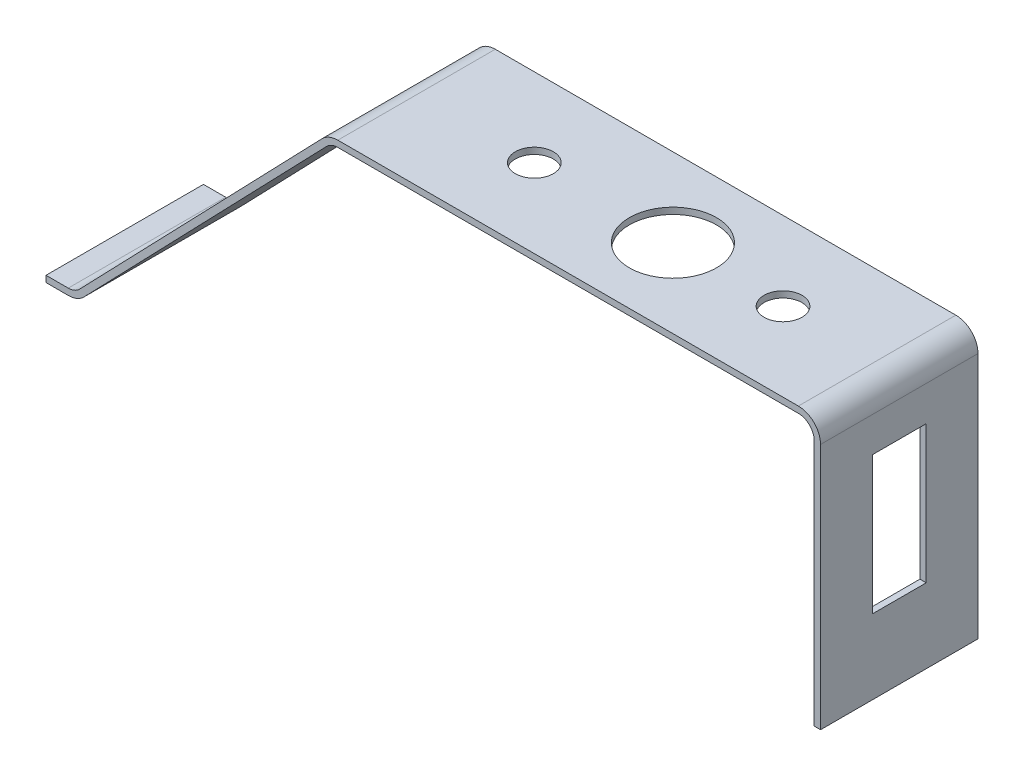
ISO-10303-21;
HEADER;
FILE_DESCRIPTION(('STEP AP214'),'2;1');
FILE_NAME('part.step','',(''),(''),'','','');
FILE_SCHEMA(('AUTOMOTIVE_DESIGN { 1 0 10303 214 1 1 1 1 }'));
ENDSEC;
DATA;
#1=APPLICATION_CONTEXT('core data for automotive mechanical design processes');
#2=APPLICATION_PROTOCOL_DEFINITION('international standard','automotive_design',2000,#1);
#3=PRODUCT_CONTEXT('',#1,'mechanical');
#4=PRODUCT('Part','Part','',(#3));
#5=PRODUCT_RELATED_PRODUCT_CATEGORY('part','',(#4));
#6=PRODUCT_DEFINITION_FORMATION('','',#4);
#7=PRODUCT_DEFINITION_CONTEXT('part definition',#1,'design');
#8=PRODUCT_DEFINITION('design','',#6,#7);
#9=PRODUCT_DEFINITION_SHAPE('','',#8);
#10=(LENGTH_UNIT() NAMED_UNIT(*) SI_UNIT(.MILLI.,.METRE.));
#11=(NAMED_UNIT(*) PLANE_ANGLE_UNIT() SI_UNIT($,.RADIAN.));
#12=(NAMED_UNIT(*) SI_UNIT($,.STERADIAN.) SOLID_ANGLE_UNIT());
#13=UNCERTAINTY_MEASURE_WITH_UNIT(LENGTH_MEASURE(1.E-05),#10,'distance_accuracy_value','');
#14=(GEOMETRIC_REPRESENTATION_CONTEXT(3) GLOBAL_UNCERTAINTY_ASSIGNED_CONTEXT((#13)) GLOBAL_UNIT_ASSIGNED_CONTEXT((#10,
#11,#12)) REPRESENTATION_CONTEXT('',''));
#15=CARTESIAN_POINT('',(0.,0.,0.));
#16=DIRECTION('',(0.,0.,1.));
#17=DIRECTION('',(1.,0.,0.));
#18=AXIS2_PLACEMENT_3D('',#15,#16,#17);
#19=CARTESIAN_POINT('',(61.595,19.812,6.3119));
#20=DIRECTION('',(1.,0.,0.));
#21=DIRECTION('',(0.,0.,-1.));
#22=AXIS2_PLACEMENT_3D('',#19,#20,#21);
#23=PLANE('',#22);
#24=DIRECTION('',(0.,0.,1.));
#25=VECTOR('',#24,1.);
#26=CARTESIAN_POINT('',(61.595,5.969,2.159));
#27=LINE('',#26,#25);
#28=CARTESIAN_POINT('',(61.595,5.969,-2.159));
#29=VERTEX_POINT('',#28);
#30=CARTESIAN_POINT('',(61.595,5.969,2.159));
#31=VERTEX_POINT('',#30);
#32=EDGE_CURVE('E183',#29,#31,#27,.T.);
#33=ORIENTED_EDGE('',*,*,#32,.F.);
#34=DIRECTION('',(0.,-1.,0.));
#35=VECTOR('',#34,1.);
#36=CARTESIAN_POINT('',(61.595,17.018,-2.159));
#37=LINE('',#36,#35);
#38=CARTESIAN_POINT('',(61.595,17.018,-2.159));
#39=VERTEX_POINT('',#38);
#40=EDGE_CURVE('E191',#39,#29,#37,.T.);
#41=ORIENTED_EDGE('',*,*,#40,.F.);
#42=DIRECTION('',(0.,0.,-1.));
#43=VECTOR('',#42,1.);
#44=CARTESIAN_POINT('',(61.595,17.018,2.159));
#45=LINE('',#44,#43);
#46=CARTESIAN_POINT('',(61.595,17.018,2.159));
#47=VERTEX_POINT('',#46);
#48=EDGE_CURVE('E197',#47,#39,#45,.T.);
#49=ORIENTED_EDGE('',*,*,#48,.F.);
#50=DIRECTION('',(0.,1.,0.));
#51=VECTOR('',#50,1.);
#52=CARTESIAN_POINT('',(61.595,17.018,2.159));
#53=LINE('',#52,#51);
#54=EDGE_CURVE('E58',#31,#47,#53,.T.);
#55=ORIENTED_EDGE('',*,*,#54,.F.);
#56=EDGE_LOOP('',(#33,#41,#49,#55));
#57=FACE_BOUND('',#56,.T.);
#58=DIRECTION('',(0.,-1.,0.));
#59=VECTOR('',#58,1.);
#60=CARTESIAN_POINT('',(61.595,19.812,-6.3119));
#61=LINE('',#60,#59);
#62=CARTESIAN_POINT('',(61.595,19.812,-6.3119));
#63=VERTEX_POINT('',#62);
#64=CARTESIAN_POINT('',(61.595,0.,-6.3119));
#65=VERTEX_POINT('',#64);
#66=EDGE_CURVE('E205',#63,#65,#61,.T.);
#67=ORIENTED_EDGE('',*,*,#66,.T.);
#68=DIRECTION('',(0.,0.,-1.));
#69=VECTOR('',#68,1.);
#70=CARTESIAN_POINT('',(61.595,0.,6.3119));
#71=LINE('',#70,#69);
#72=CARTESIAN_POINT('',(61.595,0.,6.3119));
#73=VERTEX_POINT('',#72);
#74=EDGE_CURVE('E11',#73,#65,#71,.T.);
#75=ORIENTED_EDGE('',*,*,#74,.F.);
#76=DIRECTION('',(0.,-1.,0.));
#77=VECTOR('',#76,1.);
#78=CARTESIAN_POINT('',(61.595,19.812,6.3119));
#79=LINE('',#78,#77);
#80=CARTESIAN_POINT('',(61.595,19.812,6.3119));
#81=VERTEX_POINT('',#80);
#82=EDGE_CURVE('E217',#81,#73,#79,.T.);
#83=ORIENTED_EDGE('',*,*,#82,.F.);
#84=DIRECTION('',(0.,0.,-1.));
#85=VECTOR('',#84,1.);
#86=CARTESIAN_POINT('',(61.595,19.812,6.3119));
#87=LINE('',#86,#85);
#88=EDGE_CURVE('E275',#81,#63,#87,.T.);
#89=ORIENTED_EDGE('',*,*,#88,.T.);
#90=EDGE_LOOP('',(#67,#75,#83,#89));
#91=FACE_BOUND('',#90,.T.);
#92=ADVANCED_FACE('F43',(#57,#91),#23,.F.);
#93=CARTESIAN_POINT('',(62.103,0.,6.3119));
#94=DIRECTION('',(0.,-1.,0.));
#95=DIRECTION('',(0.,0.,-1.));
#96=AXIS2_PLACEMENT_3D('',#93,#94,#95);
#97=PLANE('',#96);
#98=DIRECTION('',(-1.,0.,0.));
#99=VECTOR('',#98,1.);
#100=CARTESIAN_POINT('',(62.103,0.,-6.3119));
#101=LINE('',#100,#99);
#102=CARTESIAN_POINT('',(62.103,0.,-6.3119));
#103=VERTEX_POINT('',#102);
#104=EDGE_CURVE('E279',#103,#65,#101,.T.);
#105=ORIENTED_EDGE('',*,*,#104,.F.);
#106=DIRECTION('',(0.,0.,-1.));
#107=VECTOR('',#106,1.);
#108=CARTESIAN_POINT('',(62.103,0.,6.3119));
#109=LINE('',#108,#107);
#110=CARTESIAN_POINT('',(62.103,0.,6.3119));
#111=VERTEX_POINT('',#110);
#112=EDGE_CURVE('E51',#111,#103,#109,.T.);
#113=ORIENTED_EDGE('',*,*,#112,.F.);
#114=DIRECTION('',(-1.,0.,0.));
#115=VECTOR('',#114,1.);
#116=CARTESIAN_POINT('',(62.103,0.,6.3119));
#117=LINE('',#116,#115);
#118=EDGE_CURVE('E220',#111,#73,#117,.T.);
#119=ORIENTED_EDGE('',*,*,#118,.T.);
#120=ORIENTED_EDGE('',*,*,#74,.T.);
#121=EDGE_LOOP('',(#105,#113,#119,#120));
#122=FACE_BOUND('',#121,.T.);
#123=ADVANCED_FACE('F388',(#122),#97,.T.);
#124=CARTESIAN_POINT('',(62.103,19.812,6.3119));
#125=DIRECTION('',(1.,0.,0.));
#126=DIRECTION('',(0.,0.,-1.));
#127=AXIS2_PLACEMENT_3D('',#124,#125,#126);
#128=PLANE('',#127);
#129=DIRECTION('',(0.,1.,0.));
#130=VECTOR('',#129,1.);
#131=CARTESIAN_POINT('',(62.103,17.018,-2.159));
#132=LINE('',#131,#130);
#133=CARTESIAN_POINT('',(62.103,5.969,-2.159));
#134=VERTEX_POINT('',#133);
#135=CARTESIAN_POINT('',(62.103,17.018,-2.159));
#136=VERTEX_POINT('',#135);
#137=EDGE_CURVE('E66',#134,#136,#132,.T.);
#138=ORIENTED_EDGE('',*,*,#137,.F.);
#139=DIRECTION('',(0.,0.,-1.));
#140=VECTOR('',#139,1.);
#141=CARTESIAN_POINT('',(62.103,5.969,2.159));
#142=LINE('',#141,#140);
#143=CARTESIAN_POINT('',(62.103,5.969,2.159));
#144=VERTEX_POINT('',#143);
#145=EDGE_CURVE('E185',#144,#134,#142,.T.);
#146=ORIENTED_EDGE('',*,*,#145,.F.);
#147=DIRECTION('',(0.,-1.,0.));
#148=VECTOR('',#147,1.);
#149=CARTESIAN_POINT('',(62.103,17.018,2.159));
#150=LINE('',#149,#148);
#151=CARTESIAN_POINT('',(62.103,17.018,2.159));
#152=VERTEX_POINT('',#151);
#153=EDGE_CURVE('E484',#152,#144,#150,.T.);
#154=ORIENTED_EDGE('',*,*,#153,.F.);
#155=DIRECTION('',(0.,0.,1.));
#156=VECTOR('',#155,1.);
#157=CARTESIAN_POINT('',(62.103,17.018,2.159));
#158=LINE('',#157,#156);
#159=EDGE_CURVE('E479',#136,#152,#158,.T.);
#160=ORIENTED_EDGE('',*,*,#159,.F.);
#161=EDGE_LOOP('',(#138,#146,#154,#160));
#162=FACE_BOUND('',#161,.T.);
#163=DIRECTION('',(0.,1.,0.));
#164=VECTOR('',#163,1.);
#165=CARTESIAN_POINT('',(62.103,19.812,-6.3119));
#166=LINE('',#165,#164);
#167=CARTESIAN_POINT('',(62.103,19.812,-6.3119));
#168=VERTEX_POINT('',#167);
#169=EDGE_CURVE('E283',#168,#103,#166,.F.);
#170=ORIENTED_EDGE('',*,*,#169,.F.);
#171=DIRECTION('',(0.,0.,-1.));
#172=VECTOR('',#171,1.);
#173=CARTESIAN_POINT('',(62.103,19.812,6.3119));
#174=LINE('',#173,#172);
#175=CARTESIAN_POINT('',(62.103,19.812,6.3119));
#176=VERTEX_POINT('',#175);
#177=EDGE_CURVE('E376',#176,#168,#174,.T.);
#178=ORIENTED_EDGE('',*,*,#177,.F.);
#179=DIRECTION('',(0.,1.,0.));
#180=VECTOR('',#179,1.);
#181=CARTESIAN_POINT('',(62.103,19.812,6.3119));
#182=LINE('',#181,#180);
#183=EDGE_CURVE('E225',#176,#111,#182,.F.);
#184=ORIENTED_EDGE('',*,*,#183,.T.);
#185=ORIENTED_EDGE('',*,*,#112,.T.);
#186=EDGE_LOOP('',(#170,#178,#184,#185));
#187=FACE_BOUND('',#186,.T.);
#188=ADVANCED_FACE('F384',(#162,#187),#128,.T.);
#189=CARTESIAN_POINT('',(60.325,19.812,6.3119));
#190=DIRECTION('',(0.,0.,-1.));
#191=DIRECTION('',(-1.,0.,0.));
#192=AXIS2_PLACEMENT_3D('',#189,#190,#191);
#193=CYLINDRICAL_SURFACE('',#192,1.778);
#194=CARTESIAN_POINT('',(60.325,19.812,-6.3119));
#195=DIRECTION('',(0.,0.,1.));
#196=DIRECTION('',(1.,0.,0.));
#197=AXIS2_PLACEMENT_3D('',#194,#195,#196);
#198=CIRCLE('',#197,1.778);
#199=CARTESIAN_POINT('',(60.325,21.59,-6.3119));
#200=VERTEX_POINT('',#199);
#201=EDGE_CURVE('E287',#200,#168,#198,.F.);
#202=ORIENTED_EDGE('',*,*,#201,.F.);
#203=DIRECTION('',(0.,0.,-1.));
#204=VECTOR('',#203,1.);
#205=CARTESIAN_POINT('',(60.325,21.59,6.3119));
#206=LINE('',#205,#204);
#207=CARTESIAN_POINT('',(60.325,21.59,6.3119));
#208=VERTEX_POINT('',#207);
#209=EDGE_CURVE('E373',#208,#200,#206,.T.);
#210=ORIENTED_EDGE('',*,*,#209,.F.);
#211=CARTESIAN_POINT('',(60.325,19.812,6.3119));
#212=DIRECTION('',(0.,0.,1.));
#213=DIRECTION('',(1.,0.,0.));
#214=AXIS2_PLACEMENT_3D('',#211,#212,#213);
#215=CIRCLE('',#214,1.778);
#216=EDGE_CURVE('E229',#208,#176,#215,.F.);
#217=ORIENTED_EDGE('',*,*,#216,.T.);
#218=ORIENTED_EDGE('',*,*,#177,.T.);
#219=EDGE_LOOP('',(#202,#210,#217,#218));
#220=FACE_BOUND('',#219,.T.);
#221=ADVANCED_FACE('F396',(#220),#193,.T.);
#222=CARTESIAN_POINT('',(23.3997947565347,21.59,6.3119));
#223=DIRECTION('',(0.,1.,0.));
#224=DIRECTION('',(-1.,0.,0.));
#225=AXIS2_PLACEMENT_3D('',#222,#223,#224);
#226=PLANE('',#225);
#227=CARTESIAN_POINT('',(52.7812,21.59,0.));
#228=DIRECTION('',(0.,1.,0.));
#229=DIRECTION('',(-1.,0.,0.));
#230=AXIS2_PLACEMENT_3D('',#227,#228,#229);
#231=CIRCLE('',#230,1.524);
#232=CARTESIAN_POINT('',(51.2572,21.59,0.));
#233=VERTEX_POINT('',#232);
#234=EDGE_CURVE('E507',#233,#233,#231,.T.);
#235=ORIENTED_EDGE('',*,*,#234,.F.);
#236=EDGE_LOOP('',(#235));
#237=FACE_BOUND('',#236,.T.);
#238=CARTESIAN_POINT('',(43.9547,21.59,0.));
#239=DIRECTION('',(0.,1.,0.));
#240=DIRECTION('',(-1.,0.,0.));
#241=AXIS2_PLACEMENT_3D('',#238,#239,#240);
#242=CIRCLE('',#241,3.49250000000001);
#243=CARTESIAN_POINT('',(40.4622,21.59,0.));
#244=VERTEX_POINT('',#243);
#245=EDGE_CURVE('E498',#244,#244,#242,.T.);
#246=ORIENTED_EDGE('',*,*,#245,.F.);
#247=EDGE_LOOP('',(#246));
#248=FACE_BOUND('',#247,.T.);
#249=CARTESIAN_POINT('',(32.8422,21.59,0.));
#250=DIRECTION('',(0.,1.,0.));
#251=DIRECTION('',(-1.,0.,0.));
#252=AXIS2_PLACEMENT_3D('',#249,#250,#251);
#253=CIRCLE('',#252,1.524);
#254=CARTESIAN_POINT('',(31.3182,21.59,0.));
#255=VERTEX_POINT('',#254);
#256=EDGE_CURVE('E499',#255,#255,#253,.T.);
#257=ORIENTED_EDGE('',*,*,#256,.F.);
#258=EDGE_LOOP('',(#257));
#259=FACE_BOUND('',#258,.T.);
#260=DIRECTION('',(1.,0.,0.));
#261=VECTOR('',#260,1.);
#262=CARTESIAN_POINT('',(23.3997947565347,21.59,-6.3119));
#263=LINE('',#262,#261);
#264=CARTESIAN_POINT('',(23.3997947565347,21.59,-6.3119));
#265=VERTEX_POINT('',#264);
#266=EDGE_CURVE('E291',#265,#200,#263,.T.);
#267=ORIENTED_EDGE('',*,*,#266,.F.);
#268=DIRECTION('',(0.,0.,-1.));
#269=VECTOR('',#268,1.);
#270=CARTESIAN_POINT('',(23.3997947565347,21.59,6.3119));
#271=LINE('',#270,#269);
#272=CARTESIAN_POINT('',(23.3997947565347,21.59,6.3119));
#273=VERTEX_POINT('',#272);
#274=EDGE_CURVE('E370',#273,#265,#271,.T.);
#275=ORIENTED_EDGE('',*,*,#274,.F.);
#276=DIRECTION('',(1.,0.,0.));
#277=VECTOR('',#276,1.);
#278=CARTESIAN_POINT('',(23.3997947565347,21.59,6.3119));
#279=LINE('',#278,#277);
#280=EDGE_CURVE('E233',#273,#208,#279,.T.);
#281=ORIENTED_EDGE('',*,*,#280,.T.);
#282=ORIENTED_EDGE('',*,*,#209,.T.);
#283=EDGE_LOOP('',(#267,#275,#281,#282));
#284=FACE_BOUND('',#283,.T.);
#285=ADVANCED_FACE('F453',(#237,#248,#259,#284),#226,.T.);
#286=CARTESIAN_POINT('',(23.3997947565347,19.812,6.3119));
#287=DIRECTION('',(0.,0.,-1.));
#288=DIRECTION('',(-1.,0.,0.));
#289=AXIS2_PLACEMENT_3D('',#286,#287,#288);
#290=CYLINDRICAL_SURFACE('',#289,1.778);
#291=CARTESIAN_POINT('',(23.3997947565347,19.812,-6.3119));
#292=DIRECTION('',(0.,0.,1.));
#293=DIRECTION('',(1.,0.,0.));
#294=AXIS2_PLACEMENT_3D('',#291,#292,#293);
#295=CIRCLE('',#294,1.778);
#296=CARTESIAN_POINT('',(22.1196363918064,21.0458875804611,-6.3119));
#297=VERTEX_POINT('',#296);
#298=EDGE_CURVE('E295',#297,#265,#295,.F.);
#299=ORIENTED_EDGE('',*,*,#298,.F.);
#300=DIRECTION('',(0.,0.,-1.));
#301=VECTOR('',#300,1.);
#302=CARTESIAN_POINT('',(22.1196363918064,21.0458875804611,6.3119));
#303=LINE('',#302,#301);
#304=CARTESIAN_POINT('',(22.1196363918064,21.0458875804611,6.3119));
#305=VERTEX_POINT('',#304);
#306=EDGE_CURVE('E367',#305,#297,#303,.T.);
#307=ORIENTED_EDGE('',*,*,#306,.F.);
#308=CARTESIAN_POINT('',(23.3997947565347,19.812,6.3119));
#309=DIRECTION('',(0.,0.,1.));
#310=DIRECTION('',(1.,0.,0.));
#311=AXIS2_PLACEMENT_3D('',#308,#309,#310);
#312=CIRCLE('',#311,1.778);
#313=EDGE_CURVE('E237',#305,#273,#312,.F.);
#314=ORIENTED_EDGE('',*,*,#313,.T.);
#315=ORIENTED_EDGE('',*,*,#274,.T.);
#316=EDGE_LOOP('',(#299,#307,#314,#315));
#317=FACE_BOUND('',#316,.T.);
#318=ADVANCED_FACE('F451',(#317),#290,.T.);
#319=CARTESIAN_POINT('',(2.69868617280018,0.896651728242101,6.3119));
#320=DIRECTION('',(-0.719999080274661,0.693975017132204,0.));
#321=DIRECTION('',(-0.693975017132204,-0.719999080274661,0.));
#322=AXIS2_PLACEMENT_3D('',#319,#320,#321);
#323=PLANE('',#322);
#324=DIRECTION('',(0.693975017132204,0.719999080274661,0.));
#325=VECTOR('',#324,1.);
#326=CARTESIAN_POINT('',(2.69868617280018,0.896651728242101,-6.3119));
#327=LINE('',#326,#325);
#328=CARTESIAN_POINT('',(2.69868617280018,0.896651728242101,-6.3119));
#329=VERTEX_POINT('',#328);
#330=EDGE_CURVE('E299',#329,#297,#327,.T.);
#331=ORIENTED_EDGE('',*,*,#330,.F.);
#332=DIRECTION('',(0.,0.,-1.));
#333=VECTOR('',#332,1.);
#334=CARTESIAN_POINT('',(2.69868617280018,0.896651728242101,6.3119));
#335=LINE('',#334,#333);
#336=CARTESIAN_POINT('',(2.69868617280018,0.896651728242101,6.3119));
#337=VERTEX_POINT('',#336);
#338=EDGE_CURVE('E364',#337,#329,#335,.T.);
#339=ORIENTED_EDGE('',*,*,#338,.F.);
#340=DIRECTION('',(0.693975017132204,0.719999080274661,0.));
#341=VECTOR('',#340,1.);
#342=CARTESIAN_POINT('',(2.69868617280018,0.896651728242101,6.3119));
#343=LINE('',#342,#341);
#344=EDGE_CURVE('E241',#337,#305,#343,.T.);
#345=ORIENTED_EDGE('',*,*,#344,.T.);
#346=ORIENTED_EDGE('',*,*,#306,.T.);
#347=EDGE_LOOP('',(#331,#339,#345,#346));
#348=FACE_BOUND('',#347,.T.);
#349=ADVANCED_FACE('F447',(#348),#323,.T.);
#350=CARTESIAN_POINT('',(1.78428734085136,1.778,6.3119));
#351=DIRECTION('',(0.,0.,-1.));
#352=DIRECTION('',(-1.,0.,0.));
#353=AXIS2_PLACEMENT_3D('',#350,#351,#352);
#354=CYLINDRICAL_SURFACE('',#353,1.27);
#355=CARTESIAN_POINT('',(1.78428734085136,1.778,-6.3119));
#356=DIRECTION('',(0.,0.,1.));
#357=DIRECTION('',(1.,0.,0.));
#358=AXIS2_PLACEMENT_3D('',#355,#356,#357);
#359=CIRCLE('',#358,1.27);
#360=CARTESIAN_POINT('',(1.78428734085136,0.508,-6.3119));
#361=VERTEX_POINT('',#360);
#362=EDGE_CURVE('E303',#361,#329,#359,.T.);
#363=ORIENTED_EDGE('',*,*,#362,.F.);
#364=DIRECTION('',(0.,0.,-1.));
#365=VECTOR('',#364,1.);
#366=CARTESIAN_POINT('',(1.78428734085136,0.508,6.3119));
#367=LINE('',#366,#365);
#368=CARTESIAN_POINT('',(1.78428734085136,0.508,6.3119));
#369=VERTEX_POINT('',#368);
#370=EDGE_CURVE('E361',#369,#361,#367,.T.);
#371=ORIENTED_EDGE('',*,*,#370,.F.);
#372=CARTESIAN_POINT('',(1.78428734085136,1.778,6.3119));
#373=DIRECTION('',(0.,0.,1.));
#374=DIRECTION('',(1.,0.,0.));
#375=AXIS2_PLACEMENT_3D('',#372,#373,#374);
#376=CIRCLE('',#375,1.27);
#377=EDGE_CURVE('E245',#369,#337,#376,.T.);
#378=ORIENTED_EDGE('',*,*,#377,.T.);
#379=ORIENTED_EDGE('',*,*,#338,.T.);
#380=EDGE_LOOP('',(#363,#371,#378,#379));
#381=FACE_BOUND('',#380,.T.);
#382=ADVANCED_FACE('F443',(#381),#354,.F.);
#383=CARTESIAN_POINT('',(0.,0.508,6.3119));
#384=DIRECTION('',(0.,1.,0.));
#385=DIRECTION('',(0.,0.,1.));
#386=AXIS2_PLACEMENT_3D('',#383,#384,#385);
#387=PLANE('',#386);
#388=DIRECTION('',(1.,0.,0.));
#389=VECTOR('',#388,1.);
#390=CARTESIAN_POINT('',(0.,0.508,-6.3119));
#391=LINE('',#390,#389);
#392=CARTESIAN_POINT('',(0.,0.508,-6.3119));
#393=VERTEX_POINT('',#392);
#394=EDGE_CURVE('E307',#393,#361,#391,.T.);
#395=ORIENTED_EDGE('',*,*,#394,.F.);
#396=DIRECTION('',(0.,0.,-1.));
#397=VECTOR('',#396,1.);
#398=CARTESIAN_POINT('',(0.,0.508,6.3119));
#399=LINE('',#398,#397);
#400=CARTESIAN_POINT('',(0.,0.508,6.3119));
#401=VERTEX_POINT('',#400);
#402=EDGE_CURVE('E358',#401,#393,#399,.T.);
#403=ORIENTED_EDGE('',*,*,#402,.F.);
#404=DIRECTION('',(1.,0.,0.));
#405=VECTOR('',#404,1.);
#406=CARTESIAN_POINT('',(0.,0.508,6.3119));
#407=LINE('',#406,#405);
#408=EDGE_CURVE('E249',#401,#369,#407,.T.);
#409=ORIENTED_EDGE('',*,*,#408,.T.);
#410=ORIENTED_EDGE('',*,*,#370,.T.);
#411=EDGE_LOOP('',(#395,#403,#409,#410));
#412=FACE_BOUND('',#411,.T.);
#413=ADVANCED_FACE('F439',(#412),#387,.T.);
#414=CARTESIAN_POINT('',(0.,0.,6.3119));
#415=DIRECTION('',(-1.,0.,0.));
#416=DIRECTION('',(0.,0.,1.));
#417=AXIS2_PLACEMENT_3D('',#414,#415,#416);
#418=PLANE('',#417);
#419=DIRECTION('',(0.,1.,0.));
#420=VECTOR('',#419,1.);
#421=CARTESIAN_POINT('',(0.,0.,-6.3119));
#422=LINE('',#421,#420);
#423=CARTESIAN_POINT('',(0.,0.,-6.3119));
#424=VERTEX_POINT('',#423);
#425=EDGE_CURVE('E311',#424,#393,#422,.T.);
#426=ORIENTED_EDGE('',*,*,#425,.F.);
#427=DIRECTION('',(0.,0.,-1.));
#428=VECTOR('',#427,1.);
#429=CARTESIAN_POINT('',(0.,0.,6.3119));
#430=LINE('',#429,#428);
#431=CARTESIAN_POINT('',(0.,0.,6.3119));
#432=VERTEX_POINT('',#431);
#433=EDGE_CURVE('E355',#432,#424,#430,.T.);
#434=ORIENTED_EDGE('',*,*,#433,.F.);
#435=DIRECTION('',(0.,1.,0.));
#436=VECTOR('',#435,1.);
#437=CARTESIAN_POINT('',(0.,0.,6.3119));
#438=LINE('',#437,#436);
#439=EDGE_CURVE('E253',#432,#401,#438,.T.);
#440=ORIENTED_EDGE('',*,*,#439,.T.);
#441=ORIENTED_EDGE('',*,*,#402,.T.);
#442=EDGE_LOOP('',(#426,#434,#440,#441));
#443=FACE_BOUND('',#442,.T.);
#444=ADVANCED_FACE('F435',(#443),#418,.T.);
#445=CARTESIAN_POINT('',(0.,0.,6.3119));
#446=DIRECTION('',(0.,1.,0.));
#447=DIRECTION('',(0.,0.,1.));
#448=AXIS2_PLACEMENT_3D('',#445,#446,#447);
#449=PLANE('',#448);
#450=DIRECTION('',(1.,0.,0.));
#451=VECTOR('',#450,1.);
#452=CARTESIAN_POINT('',(0.,0.,-6.3119));
#453=LINE('',#452,#451);
#454=CARTESIAN_POINT('',(1.78428734085136,0.,-6.3119));
#455=VERTEX_POINT('',#454);
#456=EDGE_CURVE('E315',#424,#455,#453,.T.);
#457=ORIENTED_EDGE('',*,*,#456,.T.);
#458=DIRECTION('',(0.,0.,-1.));
#459=VECTOR('',#458,1.);
#460=CARTESIAN_POINT('',(1.78428734085136,0.,6.3119));
#461=LINE('',#460,#459);
#462=CARTESIAN_POINT('',(1.78428734085136,0.,6.3119));
#463=VERTEX_POINT('',#462);
#464=EDGE_CURVE('E351',#463,#455,#461,.T.);
#465=ORIENTED_EDGE('',*,*,#464,.F.);
#466=DIRECTION('',(1.,0.,0.));
#467=VECTOR('',#466,1.);
#468=CARTESIAN_POINT('',(0.,0.,6.3119));
#469=LINE('',#468,#467);
#470=EDGE_CURVE('E257',#432,#463,#469,.T.);
#471=ORIENTED_EDGE('',*,*,#470,.F.);
#472=ORIENTED_EDGE('',*,*,#433,.T.);
#473=EDGE_LOOP('',(#457,#465,#471,#472));
#474=FACE_BOUND('',#473,.T.);
#475=ADVANCED_FACE('F431',(#474),#449,.F.);
#476=CARTESIAN_POINT('',(1.78428734085136,1.778,6.3119));
#477=DIRECTION('',(0.,0.,-1.));
#478=DIRECTION('',(-1.,0.,0.));
#479=AXIS2_PLACEMENT_3D('',#476,#477,#478);
#480=CYLINDRICAL_SURFACE('',#479,1.778);
#481=CARTESIAN_POINT('',(1.78428734085136,1.778,-6.3119));
#482=DIRECTION('',(0.,0.,1.));
#483=DIRECTION('',(1.,0.,0.));
#484=AXIS2_PLACEMENT_3D('',#481,#482,#483);
#485=CIRCLE('',#484,1.778);
#486=CARTESIAN_POINT('',(3.0644457055797,0.544112419538942,-6.3119));
#487=VERTEX_POINT('',#486);
#488=EDGE_CURVE('E318',#455,#487,#485,.T.);
#489=ORIENTED_EDGE('',*,*,#488,.T.);
#490=DIRECTION('',(0.,0.,-1.));
#491=VECTOR('',#490,1.);
#492=CARTESIAN_POINT('',(3.0644457055797,0.544112419538942,6.3119));
#493=LINE('',#492,#491);
#494=CARTESIAN_POINT('',(3.0644457055797,0.544112419538942,6.3119));
#495=VERTEX_POINT('',#494);
#496=EDGE_CURVE('E347',#495,#487,#493,.T.);
#497=ORIENTED_EDGE('',*,*,#496,.F.);
#498=CARTESIAN_POINT('',(1.78428734085136,1.778,6.3119));
#499=DIRECTION('',(0.,0.,1.));
#500=DIRECTION('',(1.,0.,0.));
#501=AXIS2_PLACEMENT_3D('',#498,#499,#500);
#502=CIRCLE('',#501,1.778);
#503=EDGE_CURVE('E260',#463,#495,#502,.T.);
#504=ORIENTED_EDGE('',*,*,#503,.F.);
#505=ORIENTED_EDGE('',*,*,#464,.T.);
#506=EDGE_LOOP('',(#489,#497,#504,#505));
#507=FACE_BOUND('',#506,.T.);
#508=ADVANCED_FACE('F427',(#507),#480,.T.);
#509=CARTESIAN_POINT('',(3.0644457055797,0.544112419538942,6.3119));
#510=DIRECTION('',(-0.719999080274661,0.693975017132204,0.));
#511=DIRECTION('',(-0.693975017132204,-0.719999080274661,0.));
#512=AXIS2_PLACEMENT_3D('',#509,#510,#511);
#513=PLANE('',#512);
#514=DIRECTION('',(0.693975017132204,0.719999080274661,0.));
#515=VECTOR('',#514,1.);
#516=CARTESIAN_POINT('',(3.0644457055797,0.544112419538942,-6.3119));
#517=LINE('',#516,#515);
#518=CARTESIAN_POINT('',(22.4853959245859,20.6933482717579,-6.3119));
#519=VERTEX_POINT('',#518);
#520=EDGE_CURVE('E321',#487,#519,#517,.T.);
#521=ORIENTED_EDGE('',*,*,#520,.T.);
#522=DIRECTION('',(0.,0.,-1.));
#523=VECTOR('',#522,1.);
#524=CARTESIAN_POINT('',(22.4853959245859,20.6933482717579,6.3119));
#525=LINE('',#524,#523);
#526=CARTESIAN_POINT('',(22.4853959245859,20.6933482717579,6.3119));
#527=VERTEX_POINT('',#526);
#528=EDGE_CURVE('E343',#527,#519,#525,.T.);
#529=ORIENTED_EDGE('',*,*,#528,.F.);
#530=DIRECTION('',(0.693975017132204,0.719999080274661,0.));
#531=VECTOR('',#530,1.);
#532=CARTESIAN_POINT('',(3.0644457055797,0.544112419538942,6.3119));
#533=LINE('',#532,#531);
#534=EDGE_CURVE('E263',#495,#527,#533,.T.);
#535=ORIENTED_EDGE('',*,*,#534,.F.);
#536=ORIENTED_EDGE('',*,*,#496,.T.);
#537=EDGE_LOOP('',(#521,#529,#535,#536));
#538=FACE_BOUND('',#537,.T.);
#539=ADVANCED_FACE('F422',(#538),#513,.F.);
#540=CARTESIAN_POINT('',(23.3997947565347,19.812,6.3119));
#541=DIRECTION('',(0.,0.,-1.));
#542=DIRECTION('',(-1.,0.,0.));
#543=AXIS2_PLACEMENT_3D('',#540,#541,#542);
#544=CYLINDRICAL_SURFACE('',#543,1.27);
#545=CARTESIAN_POINT('',(23.3997947565347,19.812,-6.3119));
#546=DIRECTION('',(0.,0.,-1.));
#547=DIRECTION('',(-1.,0.,0.));
#548=AXIS2_PLACEMENT_3D('',#545,#546,#547);
#549=CIRCLE('',#548,1.27);
#550=CARTESIAN_POINT('',(23.3997947565347,21.082,-6.3119));
#551=VERTEX_POINT('',#550);
#552=EDGE_CURVE('E324',#519,#551,#549,.T.);
#553=ORIENTED_EDGE('',*,*,#552,.T.);
#554=DIRECTION('',(0.,0.,-1.));
#555=VECTOR('',#554,1.);
#556=CARTESIAN_POINT('',(23.3997947565347,21.082,6.3119));
#557=LINE('',#556,#555);
#558=CARTESIAN_POINT('',(23.3997947565347,21.082,6.3119));
#559=VERTEX_POINT('',#558);
#560=EDGE_CURVE('E339',#559,#551,#557,.T.);
#561=ORIENTED_EDGE('',*,*,#560,.F.);
#562=CARTESIAN_POINT('',(23.3997947565347,19.812,6.3119));
#563=DIRECTION('',(0.,0.,-1.));
#564=DIRECTION('',(-1.,0.,0.));
#565=AXIS2_PLACEMENT_3D('',#562,#563,#564);
#566=CIRCLE('',#565,1.27);
#567=EDGE_CURVE('E266',#527,#559,#566,.T.);
#568=ORIENTED_EDGE('',*,*,#567,.F.);
#569=ORIENTED_EDGE('',*,*,#528,.T.);
#570=EDGE_LOOP('',(#553,#561,#568,#569));
#571=FACE_BOUND('',#570,.T.);
#572=ADVANCED_FACE('F416',(#571),#544,.F.);
#573=CARTESIAN_POINT('',(23.3997947565347,21.082,6.3119));
#574=DIRECTION('',(0.,1.,0.));
#575=DIRECTION('',(-1.,0.,0.));
#576=AXIS2_PLACEMENT_3D('',#573,#574,#575);
#577=PLANE('',#576);
#578=CARTESIAN_POINT('',(52.7812,21.082,0.));
#579=DIRECTION('',(0.,1.,0.));
#580=DIRECTION('',(-1.,0.,0.));
#581=AXIS2_PLACEMENT_3D('',#578,#579,#580);
#582=CIRCLE('',#581,1.524);
#583=CARTESIAN_POINT('',(51.2572,21.082,0.));
#584=VERTEX_POINT('',#583);
#585=EDGE_CURVE('E216',#584,#584,#582,.F.);
#586=ORIENTED_EDGE('',*,*,#585,.F.);
#587=EDGE_LOOP('',(#586));
#588=FACE_BOUND('',#587,.T.);
#589=CARTESIAN_POINT('',(43.9547,21.082,0.));
#590=DIRECTION('',(0.,1.,0.));
#591=DIRECTION('',(-1.,0.,0.));
#592=AXIS2_PLACEMENT_3D('',#589,#590,#591);
#593=CIRCLE('',#592,3.49250000000001);
#594=CARTESIAN_POINT('',(40.4622,21.082,0.));
#595=VERTEX_POINT('',#594);
#596=EDGE_CURVE('E503',#595,#595,#593,.F.);
#597=ORIENTED_EDGE('',*,*,#596,.F.);
#598=EDGE_LOOP('',(#597));
#599=FACE_BOUND('',#598,.T.);
#600=CARTESIAN_POINT('',(32.8422,21.082,0.));
#601=DIRECTION('',(0.,1.,0.));
#602=DIRECTION('',(-1.,0.,0.));
#603=AXIS2_PLACEMENT_3D('',#600,#601,#602);
#604=CIRCLE('',#603,1.524);
#605=CARTESIAN_POINT('',(31.3182,21.082,0.));
#606=VERTEX_POINT('',#605);
#607=EDGE_CURVE('E494',#606,#606,#604,.F.);
#608=ORIENTED_EDGE('',*,*,#607,.F.);
#609=EDGE_LOOP('',(#608));
#610=FACE_BOUND('',#609,.T.);
#611=DIRECTION('',(1.,0.,0.));
#612=VECTOR('',#611,1.);
#613=CARTESIAN_POINT('',(23.3997947565347,21.082,-6.3119));
#614=LINE('',#613,#612);
#615=CARTESIAN_POINT('',(60.325,21.082,-6.3119));
#616=VERTEX_POINT('',#615);
#617=EDGE_CURVE('E327',#551,#616,#614,.T.);
#618=ORIENTED_EDGE('',*,*,#617,.T.);
#619=DIRECTION('',(0.,0.,-1.));
#620=VECTOR('',#619,1.);
#621=CARTESIAN_POINT('',(60.325,21.082,6.3119));
#622=LINE('',#621,#620);
#623=CARTESIAN_POINT('',(60.325,21.082,6.3119));
#624=VERTEX_POINT('',#623);
#625=EDGE_CURVE('E335',#624,#616,#622,.T.);
#626=ORIENTED_EDGE('',*,*,#625,.F.);
#627=DIRECTION('',(1.,0.,0.));
#628=VECTOR('',#627,1.);
#629=CARTESIAN_POINT('',(23.3997947565347,21.082,6.3119));
#630=LINE('',#629,#628);
#631=EDGE_CURVE('E269',#559,#624,#630,.T.);
#632=ORIENTED_EDGE('',*,*,#631,.F.);
#633=ORIENTED_EDGE('',*,*,#560,.T.);
#634=EDGE_LOOP('',(#618,#626,#632,#633));
#635=FACE_BOUND('',#634,.T.);
#636=ADVANCED_FACE('F412',(#588,#599,#610,#635),#577,.F.);
#637=CARTESIAN_POINT('',(60.325,19.812,6.3119));
#638=DIRECTION('',(0.,0.,-1.));
#639=DIRECTION('',(-1.,0.,0.));
#640=AXIS2_PLACEMENT_3D('',#637,#638,#639);
#641=CYLINDRICAL_SURFACE('',#640,1.27);
#642=CARTESIAN_POINT('',(60.325,19.812,-6.3119));
#643=DIRECTION('',(0.,0.,-1.));
#644=DIRECTION('',(-1.,0.,0.));
#645=AXIS2_PLACEMENT_3D('',#642,#643,#644);
#646=CIRCLE('',#645,1.27);
#647=EDGE_CURVE('E221',#616,#63,#646,.T.);
#648=ORIENTED_EDGE('',*,*,#647,.T.);
#649=ORIENTED_EDGE('',*,*,#88,.F.);
#650=CARTESIAN_POINT('',(60.325,19.812,6.3119));
#651=DIRECTION('',(0.,0.,-1.));
#652=DIRECTION('',(-1.,0.,0.));
#653=AXIS2_PLACEMENT_3D('',#650,#651,#652);
#654=CIRCLE('',#653,1.27);
#655=EDGE_CURVE('E272',#624,#81,#654,.T.);
#656=ORIENTED_EDGE('',*,*,#655,.F.);
#657=ORIENTED_EDGE('',*,*,#625,.T.);
#658=EDGE_LOOP('',(#648,#649,#656,#657));
#659=FACE_BOUND('',#658,.T.);
#660=ADVANCED_FACE('F408',(#659),#641,.F.);
#661=CARTESIAN_POINT('',(60.325,19.812,6.3119));
#662=DIRECTION('',(0.,0.,1.));
#663=DIRECTION('',(1.,0.,0.));
#664=AXIS2_PLACEMENT_3D('',#661,#662,#663);
#665=PLANE('',#664);
#666=ORIENTED_EDGE('',*,*,#82,.T.);
#667=ORIENTED_EDGE('',*,*,#118,.F.);
#668=ORIENTED_EDGE('',*,*,#183,.F.);
#669=ORIENTED_EDGE('',*,*,#216,.F.);
#670=ORIENTED_EDGE('',*,*,#280,.F.);
#671=ORIENTED_EDGE('',*,*,#313,.F.);
#672=ORIENTED_EDGE('',*,*,#344,.F.);
#673=ORIENTED_EDGE('',*,*,#377,.F.);
#674=ORIENTED_EDGE('',*,*,#408,.F.);
#675=ORIENTED_EDGE('',*,*,#439,.F.);
#676=ORIENTED_EDGE('',*,*,#470,.T.);
#677=ORIENTED_EDGE('',*,*,#503,.T.);
#678=ORIENTED_EDGE('',*,*,#534,.T.);
#679=ORIENTED_EDGE('',*,*,#567,.T.);
#680=ORIENTED_EDGE('',*,*,#631,.T.);
#681=ORIENTED_EDGE('',*,*,#655,.T.);
#682=EDGE_LOOP('',(#666,#667,#668,#669,#670,#671,#672,#673,#674,#675,#676,#677,#678,#679,#680,#681));
#683=FACE_BOUND('',#682,.T.);
#684=ADVANCED_FACE('F399',(#683),#665,.T.);
#685=CARTESIAN_POINT('',(60.325,19.812,-6.3119));
#686=DIRECTION('',(0.,0.,1.));
#687=DIRECTION('',(1.,0.,0.));
#688=AXIS2_PLACEMENT_3D('',#685,#686,#687);
#689=PLANE('',#688);
#690=ORIENTED_EDGE('',*,*,#66,.F.);
#691=ORIENTED_EDGE('',*,*,#647,.F.);
#692=ORIENTED_EDGE('',*,*,#617,.F.);
#693=ORIENTED_EDGE('',*,*,#552,.F.);
#694=ORIENTED_EDGE('',*,*,#520,.F.);
#695=ORIENTED_EDGE('',*,*,#488,.F.);
#696=ORIENTED_EDGE('',*,*,#456,.F.);
#697=ORIENTED_EDGE('',*,*,#425,.T.);
#698=ORIENTED_EDGE('',*,*,#394,.T.);
#699=ORIENTED_EDGE('',*,*,#362,.T.);
#700=ORIENTED_EDGE('',*,*,#330,.T.);
#701=ORIENTED_EDGE('',*,*,#298,.T.);
#702=ORIENTED_EDGE('',*,*,#266,.T.);
#703=ORIENTED_EDGE('',*,*,#201,.T.);
#704=ORIENTED_EDGE('',*,*,#169,.T.);
#705=ORIENTED_EDGE('',*,*,#104,.T.);
#706=EDGE_LOOP('',(#690,#691,#692,#693,#694,#695,#696,#697,#698,#699,#700,#701,#702,#703,#704,#705));
#707=FACE_BOUND('',#706,.T.);
#708=ADVANCED_FACE('F392',(#707),#689,.F.);
#709=CARTESIAN_POINT('',(-0.001000000000001,17.018,-2.159));
#710=DIRECTION('',(0.,0.,-1.));
#711=DIRECTION('',(0.,1.,0.));
#712=AXIS2_PLACEMENT_3D('',#709,#710,#711);
#713=PLANE('',#712);
#714=ORIENTED_EDGE('',*,*,#40,.T.);
#715=DIRECTION('',(1.,0.,0.));
#716=VECTOR('',#715,1.);
#717=CARTESIAN_POINT('',(-0.001000000000001,5.969,-2.159));
#718=LINE('',#717,#716);
#719=EDGE_CURVE('E179',#29,#134,#718,.T.);
#720=ORIENTED_EDGE('',*,*,#719,.T.);
#721=ORIENTED_EDGE('',*,*,#137,.T.);
#722=DIRECTION('',(1.,0.,0.));
#723=VECTOR('',#722,1.);
#724=CARTESIAN_POINT('',(-0.001000000000001,17.018,-2.159));
#725=LINE('',#724,#723);
#726=EDGE_CURVE('E188',#39,#136,#725,.T.);
#727=ORIENTED_EDGE('',*,*,#726,.F.);
#728=EDGE_LOOP('',(#714,#720,#721,#727));
#729=FACE_BOUND('',#728,.T.);
#730=ADVANCED_FACE('F192',(#729),#713,.F.);
#731=CARTESIAN_POINT('',(-0.001000000000001,5.969,2.159));
#732=DIRECTION('',(0.,-1.,0.));
#733=DIRECTION('',(0.,0.,-1.));
#734=AXIS2_PLACEMENT_3D('',#731,#732,#733);
#735=PLANE('',#734);
#736=ORIENTED_EDGE('',*,*,#32,.T.);
#737=DIRECTION('',(1.,0.,0.));
#738=VECTOR('',#737,1.);
#739=CARTESIAN_POINT('',(-0.001000000000001,5.969,2.159));
#740=LINE('',#739,#738);
#741=EDGE_CURVE('E187',#31,#144,#740,.T.);
#742=ORIENTED_EDGE('',*,*,#741,.T.);
#743=ORIENTED_EDGE('',*,*,#145,.T.);
#744=ORIENTED_EDGE('',*,*,#719,.F.);
#745=EDGE_LOOP('',(#736,#742,#743,#744));
#746=FACE_BOUND('',#745,.T.);
#747=ADVANCED_FACE('F181',(#746),#735,.F.);
#748=CARTESIAN_POINT('',(-0.001000000000001,17.018,2.159));
#749=DIRECTION('',(0.,0.,1.));
#750=DIRECTION('',(0.,-1.,0.));
#751=AXIS2_PLACEMENT_3D('',#748,#749,#750);
#752=PLANE('',#751);
#753=ORIENTED_EDGE('',*,*,#54,.T.);
#754=DIRECTION('',(1.,0.,0.));
#755=VECTOR('',#754,1.);
#756=CARTESIAN_POINT('',(-0.001000000000001,17.018,2.159));
#757=LINE('',#756,#755);
#758=EDGE_CURVE('E211',#47,#152,#757,.T.);
#759=ORIENTED_EDGE('',*,*,#758,.T.);
#760=ORIENTED_EDGE('',*,*,#153,.T.);
#761=ORIENTED_EDGE('',*,*,#741,.F.);
#762=EDGE_LOOP('',(#753,#759,#760,#761));
#763=FACE_BOUND('',#762,.T.);
#764=ADVANCED_FACE('F544',(#763),#752,.F.);
#765=CARTESIAN_POINT('',(-0.001000000000001,17.018,2.159));
#766=DIRECTION('',(0.,1.,0.));
#767=DIRECTION('',(0.,0.,1.));
#768=AXIS2_PLACEMENT_3D('',#765,#766,#767);
#769=PLANE('',#768);
#770=ORIENTED_EDGE('',*,*,#48,.T.);
#771=ORIENTED_EDGE('',*,*,#726,.T.);
#772=ORIENTED_EDGE('',*,*,#159,.T.);
#773=ORIENTED_EDGE('',*,*,#758,.F.);
#774=EDGE_LOOP('',(#770,#771,#772,#773));
#775=FACE_BOUND('',#774,.T.);
#776=ADVANCED_FACE('F535',(#775),#769,.F.);
#777=CARTESIAN_POINT('',(32.8422,-0.00100000000000447,0.));
#778=DIRECTION('',(0.,1.,0.));
#779=DIRECTION('',(-1.,0.,0.));
#780=AXIS2_PLACEMENT_3D('',#777,#778,#779);
#781=CYLINDRICAL_SURFACE('',#780,1.524);
#782=ORIENTED_EDGE('',*,*,#256,.T.);
#783=EDGE_LOOP('',(#782));
#784=FACE_BOUND('',#783,.T.);
#785=ORIENTED_EDGE('',*,*,#607,.T.);
#786=EDGE_LOOP('',(#785));
#787=FACE_BOUND('',#786,.T.);
#788=ADVANCED_FACE('F533',(#784,#787),#781,.F.);
#789=CARTESIAN_POINT('',(43.9547,-0.00100000000000447,0.));
#790=DIRECTION('',(0.,1.,0.));
#791=DIRECTION('',(-1.,0.,0.));
#792=AXIS2_PLACEMENT_3D('',#789,#790,#791);
#793=CYLINDRICAL_SURFACE('',#792,3.49250000000001);
#794=ORIENTED_EDGE('',*,*,#245,.T.);
#795=EDGE_LOOP('',(#794));
#796=FACE_BOUND('',#795,.T.);
#797=ORIENTED_EDGE('',*,*,#596,.T.);
#798=EDGE_LOOP('',(#797));
#799=FACE_BOUND('',#798,.T.);
#800=ADVANCED_FACE('F522',(#796,#799),#793,.F.);
#801=CARTESIAN_POINT('',(52.7812,-0.00100000000000447,0.));
#802=DIRECTION('',(0.,1.,0.));
#803=DIRECTION('',(-1.,0.,0.));
#804=AXIS2_PLACEMENT_3D('',#801,#802,#803);
#805=CYLINDRICAL_SURFACE('',#804,1.524);
#806=ORIENTED_EDGE('',*,*,#234,.T.);
#807=EDGE_LOOP('',(#806));
#808=FACE_BOUND('',#807,.T.);
#809=ORIENTED_EDGE('',*,*,#585,.T.);
#810=EDGE_LOOP('',(#809));
#811=FACE_BOUND('',#810,.T.);
#812=ADVANCED_FACE('F519',(#808,#811),#805,.F.);
#813=CLOSED_SHELL('',(#92,#123,#188,#221,#285,#318,#349,#382,#413,#444,#475,#508,#539,#572,#636,
#660,#684,#708,#730,#747,#764,#776,#788,#800,#812));
#814=MANIFOLD_SOLID_BREP('B2',#813);
#815=ADVANCED_BREP_SHAPE_REPRESENTATION('',(#18,#814),#14);
#816=SHAPE_DEFINITION_REPRESENTATION(#9,#815);
ENDSEC;
END-ISO-10303-21;
